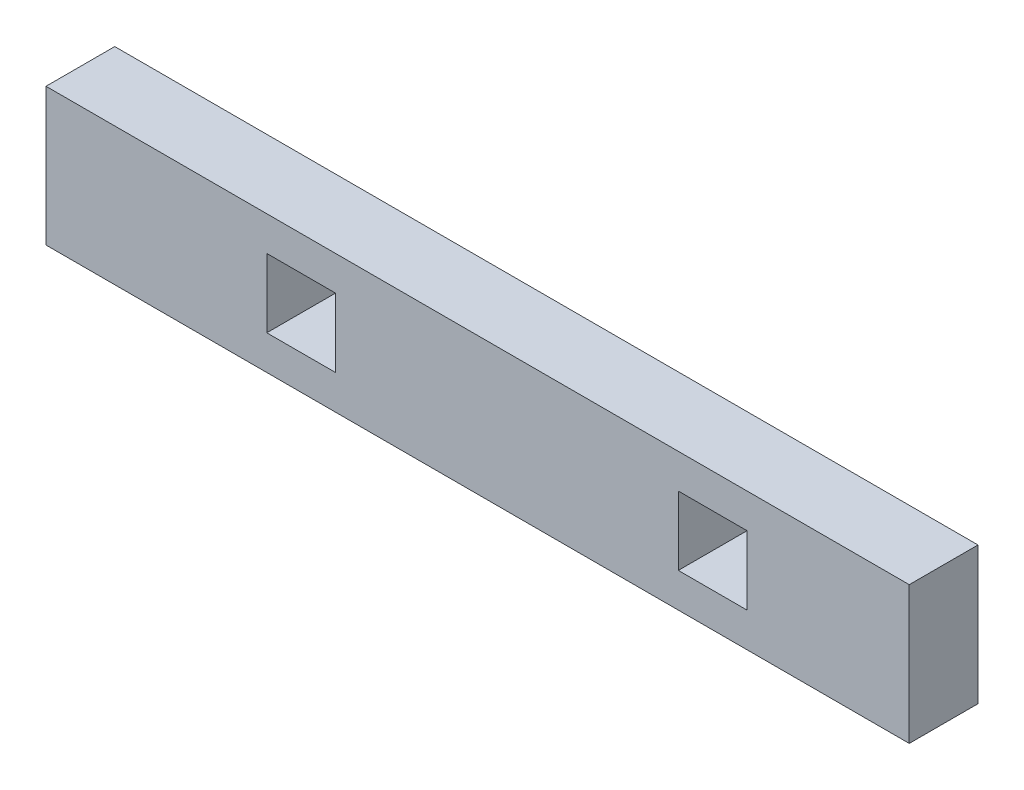
ISO-10303-21;
HEADER;
FILE_DESCRIPTION(('STEP AP214'),'2;1');
FILE_NAME('part.step','',(''),(''),'','','');
FILE_SCHEMA(('AUTOMOTIVE_DESIGN { 1 0 10303 214 1 1 1 1 }'));
ENDSEC;
DATA;
#1=APPLICATION_CONTEXT('core data for automotive mechanical design processes');
#2=APPLICATION_PROTOCOL_DEFINITION('international standard','automotive_design',2000,#1);
#3=PRODUCT_CONTEXT('',#1,'mechanical');
#4=PRODUCT('Part','Part','',(#3));
#5=PRODUCT_RELATED_PRODUCT_CATEGORY('part','',(#4));
#6=PRODUCT_DEFINITION_FORMATION('','',#4);
#7=PRODUCT_DEFINITION_CONTEXT('part definition',#1,'design');
#8=PRODUCT_DEFINITION('design','',#6,#7);
#9=PRODUCT_DEFINITION_SHAPE('','',#8);
#10=(LENGTH_UNIT() NAMED_UNIT(*) SI_UNIT(.MILLI.,.METRE.));
#11=(NAMED_UNIT(*) PLANE_ANGLE_UNIT() SI_UNIT($,.RADIAN.));
#12=(NAMED_UNIT(*) SI_UNIT($,.STERADIAN.) SOLID_ANGLE_UNIT());
#13=UNCERTAINTY_MEASURE_WITH_UNIT(LENGTH_MEASURE(1.E-05),#10,'distance_accuracy_value','');
#14=(GEOMETRIC_REPRESENTATION_CONTEXT(3) GLOBAL_UNCERTAINTY_ASSIGNED_CONTEXT((#13)) GLOBAL_UNIT_ASSIGNED_CONTEXT((#10,
#11,#12)) REPRESENTATION_CONTEXT('',''));
#15=CARTESIAN_POINT('',(0.,0.,0.));
#16=DIRECTION('',(0.,0.,1.));
#17=DIRECTION('',(1.,0.,0.));
#18=AXIS2_PLACEMENT_3D('',#15,#16,#17);
#19=CARTESIAN_POINT('',(23.5765793569799,-3.17948626636888,-43.5398164035787));
#20=DIRECTION('',(-1.,0.,0.));
#21=DIRECTION('',(0.,0.,1.));
#22=AXIS2_PLACEMENT_3D('',#19,#20,#21);
#23=PLANE('',#22);
#24=DIRECTION('',(0.,1.,0.));
#25=VECTOR('',#24,1.);
#26=CARTESIAN_POINT('',(23.5765793569799,-3.17948626636888,-3.17499999999999));
#27=LINE('',#26,#25);
#28=CARTESIAN_POINT('',(23.5765793569799,-3.17948626636888,-3.17499999999999));
#29=VERTEX_POINT('',#28);
#30=CARTESIAN_POINT('',(23.5765793569799,3.17051373363112,-3.17499999999999));
#31=VERTEX_POINT('',#30);
#32=EDGE_CURVE('E11',#29,#31,#27,.T.);
#33=ORIENTED_EDGE('',*,*,#32,.F.);
#34=DIRECTION('',(0.,0.,1.));
#35=VECTOR('',#34,1.);
#36=CARTESIAN_POINT('',(23.5765793569799,-3.17948626636888,-43.5398164035787));
#37=LINE('',#36,#35);
#38=CARTESIAN_POINT('',(23.5765793569799,-3.17948626636888,0.));
#39=VERTEX_POINT('',#38);
#40=EDGE_CURVE('E196',#29,#39,#37,.T.);
#41=ORIENTED_EDGE('',*,*,#40,.T.);
#42=DIRECTION('',(0.,-1.,0.));
#43=VECTOR('',#42,1.);
#44=CARTESIAN_POINT('',(23.5765793569799,-3.17948626636888,0.));
#45=LINE('',#44,#43);
#46=CARTESIAN_POINT('',(23.5765793569799,3.17051373363112,0.));
#47=VERTEX_POINT('',#46);
#48=EDGE_CURVE('E182',#47,#39,#45,.T.);
#49=ORIENTED_EDGE('',*,*,#48,.F.);
#50=DIRECTION('',(0.,0.,1.));
#51=VECTOR('',#50,1.);
#52=CARTESIAN_POINT('',(23.5765793569799,3.17051373363112,-43.5398164035787));
#53=LINE('',#52,#51);
#54=EDGE_CURVE('E191',#31,#47,#53,.T.);
#55=ORIENTED_EDGE('',*,*,#54,.F.);
#56=EDGE_LOOP('',(#33,#41,#49,#55));
#57=FACE_BOUND('',#56,.T.);
#58=ADVANCED_FACE('F34',(#57),#23,.T.);
#59=CARTESIAN_POINT('',(63.4387908271758,-3.17948626636888,-43.5398164035787));
#60=DIRECTION('',(0.,-1.,0.));
#61=DIRECTION('',(0.,0.,-1.));
#62=AXIS2_PLACEMENT_3D('',#59,#60,#61);
#63=PLANE('',#62);
#64=DIRECTION('',(-1.,0.,0.));
#65=VECTOR('',#64,1.);
#66=CARTESIAN_POINT('',(63.4387908271758,-3.17948626636888,-3.175));
#67=LINE('',#66,#65);
#68=CARTESIAN_POINT('',(63.4387908271758,-3.17948626636888,-3.175));
#69=VERTEX_POINT('',#68);
#70=EDGE_CURVE('E217',#69,#29,#67,.T.);
#71=ORIENTED_EDGE('',*,*,#70,.F.);
#72=DIRECTION('',(0.,0.,1.));
#73=VECTOR('',#72,1.);
#74=CARTESIAN_POINT('',(63.4387908271758,-3.17948626636888,-43.5398164035787));
#75=LINE('',#74,#73);
#76=CARTESIAN_POINT('',(63.4387908271758,-3.17948626636888,0.));
#77=VERTEX_POINT('',#76);
#78=EDGE_CURVE('E194',#69,#77,#75,.T.);
#79=ORIENTED_EDGE('',*,*,#78,.T.);
#80=DIRECTION('',(1.,0.,0.));
#81=VECTOR('',#80,1.);
#82=CARTESIAN_POINT('',(63.4387908271758,-3.17948626636888,0.));
#83=LINE('',#82,#81);
#84=EDGE_CURVE('E185',#39,#77,#83,.T.);
#85=ORIENTED_EDGE('',*,*,#84,.F.);
#86=ORIENTED_EDGE('',*,*,#40,.F.);
#87=EDGE_LOOP('',(#71,#79,#85,#86));
#88=FACE_BOUND('',#87,.T.);
#89=ADVANCED_FACE('F251',(#88),#63,.T.);
#90=CARTESIAN_POINT('',(63.4387908271758,3.17051373363112,-43.5398164035787));
#91=DIRECTION('',(1.,0.,0.));
#92=DIRECTION('',(0.,0.,-1.));
#93=AXIS2_PLACEMENT_3D('',#90,#91,#92);
#94=PLANE('',#93);
#95=DIRECTION('',(0.,-1.,0.));
#96=VECTOR('',#95,1.);
#97=CARTESIAN_POINT('',(63.4387908271758,3.17051373363112,-3.175));
#98=LINE('',#97,#96);
#99=CARTESIAN_POINT('',(63.4387908271758,3.17051373363112,-3.175));
#100=VERTEX_POINT('',#99);
#101=EDGE_CURVE('E214',#100,#69,#98,.T.);
#102=ORIENTED_EDGE('',*,*,#101,.F.);
#103=DIRECTION('',(0.,0.,1.));
#104=VECTOR('',#103,1.);
#105=CARTESIAN_POINT('',(63.4387908271758,3.17051373363112,-43.5398164035787));
#106=LINE('',#105,#104);
#107=CARTESIAN_POINT('',(63.4387908271758,3.17051373363112,0.));
#108=VERTEX_POINT('',#107);
#109=EDGE_CURVE('E192',#100,#108,#106,.T.);
#110=ORIENTED_EDGE('',*,*,#109,.T.);
#111=DIRECTION('',(0.,1.,0.));
#112=VECTOR('',#111,1.);
#113=CARTESIAN_POINT('',(63.4387908271758,3.17051373363112,0.));
#114=LINE('',#113,#112);
#115=EDGE_CURVE('E188',#77,#108,#114,.T.);
#116=ORIENTED_EDGE('',*,*,#115,.F.);
#117=ORIENTED_EDGE('',*,*,#78,.F.);
#118=EDGE_LOOP('',(#102,#110,#116,#117));
#119=FACE_BOUND('',#118,.T.);
#120=ADVANCED_FACE('F213',(#119),#94,.T.);
#121=CARTESIAN_POINT('',(23.5765793569799,3.17051373363112,-43.5398164035787));
#122=DIRECTION('',(0.,1.,0.));
#123=DIRECTION('',(0.,0.,1.));
#124=AXIS2_PLACEMENT_3D('',#121,#122,#123);
#125=PLANE('',#124);
#126=DIRECTION('',(1.,0.,0.));
#127=VECTOR('',#126,1.);
#128=CARTESIAN_POINT('',(23.5765793569799,3.17051373363112,-3.17499999999999));
#129=LINE('',#128,#127);
#130=EDGE_CURVE('E203',#31,#100,#129,.T.);
#131=ORIENTED_EDGE('',*,*,#130,.F.);
#132=ORIENTED_EDGE('',*,*,#54,.T.);
#133=DIRECTION('',(-1.,0.,0.));
#134=VECTOR('',#133,1.);
#135=CARTESIAN_POINT('',(23.5765793569799,3.17051373363112,0.));
#136=LINE('',#135,#134);
#137=EDGE_CURVE('E174',#108,#47,#136,.T.);
#138=ORIENTED_EDGE('',*,*,#137,.F.);
#139=ORIENTED_EDGE('',*,*,#109,.F.);
#140=EDGE_LOOP('',(#131,#132,#138,#139));
#141=FACE_BOUND('',#140,.T.);
#142=ADVANCED_FACE('F36',(#141),#125,.T.);
#143=CARTESIAN_POINT('',(55.9498483019922,-1.59198626636888,-43.5398164035787));
#144=DIRECTION('',(0.,-1.,0.));
#145=DIRECTION('',(0.,0.,-1.));
#146=AXIS2_PLACEMENT_3D('',#143,#144,#145);
#147=PLANE('',#146);
#148=DIRECTION('',(0.,0.,1.));
#149=VECTOR('',#148,1.);
#150=CARTESIAN_POINT('',(55.9498483019922,-1.59198626636888,-43.5398164035787));
#151=LINE('',#150,#149);
#152=CARTESIAN_POINT('',(55.9498483019922,-1.59198626636888,-3.175));
#153=VERTEX_POINT('',#152);
#154=CARTESIAN_POINT('',(55.9498483019922,-1.59198626636888,0.));
#155=VERTEX_POINT('',#154);
#156=EDGE_CURVE('E177',#153,#155,#151,.T.);
#157=ORIENTED_EDGE('',*,*,#156,.F.);
#158=DIRECTION('',(-1.,0.,0.));
#159=VECTOR('',#158,1.);
#160=CARTESIAN_POINT('',(55.9498483019922,-1.59198626636888,-3.175));
#161=LINE('',#160,#159);
#162=CARTESIAN_POINT('',(52.7748483019922,-1.59198626636888,-3.175));
#163=VERTEX_POINT('',#162);
#164=EDGE_CURVE('E53',#153,#163,#161,.T.);
#165=ORIENTED_EDGE('',*,*,#164,.T.);
#166=DIRECTION('',(0.,0.,1.));
#167=VECTOR('',#166,1.);
#168=CARTESIAN_POINT('',(52.7748483019922,-1.59198626636888,-43.5398164035787));
#169=LINE('',#168,#167);
#170=CARTESIAN_POINT('',(52.7748483019922,-1.59198626636888,0.));
#171=VERTEX_POINT('',#170);
#172=EDGE_CURVE('E171',#163,#171,#169,.T.);
#173=ORIENTED_EDGE('',*,*,#172,.T.);
#174=DIRECTION('',(1.,0.,0.));
#175=VECTOR('',#174,1.);
#176=CARTESIAN_POINT('',(55.9498483019922,-1.59198626636888,0.));
#177=LINE('',#176,#175);
#178=EDGE_CURVE('E162',#171,#155,#177,.T.);
#179=ORIENTED_EDGE('',*,*,#178,.T.);
#180=EDGE_LOOP('',(#157,#165,#173,#179));
#181=FACE_BOUND('',#180,.T.);
#182=ADVANCED_FACE('F265',(#181),#147,.F.);
#183=CARTESIAN_POINT('',(55.9498483019922,1.58301373363112,-43.5398164035787));
#184=DIRECTION('',(1.,0.,0.));
#185=DIRECTION('',(0.,0.,-1.));
#186=AXIS2_PLACEMENT_3D('',#183,#184,#185);
#187=PLANE('',#186);
#188=DIRECTION('',(0.,0.,1.));
#189=VECTOR('',#188,1.);
#190=CARTESIAN_POINT('',(55.9498483019922,1.58301373363112,-43.5398164035787));
#191=LINE('',#190,#189);
#192=CARTESIAN_POINT('',(55.9498483019922,1.58301373363112,-3.175));
#193=VERTEX_POINT('',#192);
#194=CARTESIAN_POINT('',(55.9498483019922,1.58301373363112,0.));
#195=VERTEX_POINT('',#194);
#196=EDGE_CURVE('E175',#193,#195,#191,.T.);
#197=ORIENTED_EDGE('',*,*,#196,.F.);
#198=DIRECTION('',(0.,-1.,0.));
#199=VECTOR('',#198,1.);
#200=CARTESIAN_POINT('',(55.9498483019922,1.58301373363112,-3.175));
#201=LINE('',#200,#199);
#202=EDGE_CURVE('E44',#193,#153,#201,.T.);
#203=ORIENTED_EDGE('',*,*,#202,.T.);
#204=ORIENTED_EDGE('',*,*,#156,.T.);
#205=DIRECTION('',(0.,1.,0.));
#206=VECTOR('',#205,1.);
#207=CARTESIAN_POINT('',(55.9498483019922,1.58301373363112,0.));
#208=LINE('',#207,#206);
#209=EDGE_CURVE('E165',#155,#195,#208,.T.);
#210=ORIENTED_EDGE('',*,*,#209,.T.);
#211=EDGE_LOOP('',(#197,#203,#204,#210));
#212=FACE_BOUND('',#211,.T.);
#213=ADVANCED_FACE('F268',(#212),#187,.F.);
#214=CARTESIAN_POINT('',(52.7748483019922,1.58301373363112,-43.5398164035787));
#215=DIRECTION('',(0.,1.,0.));
#216=DIRECTION('',(0.,0.,1.));
#217=AXIS2_PLACEMENT_3D('',#214,#215,#216);
#218=PLANE('',#217);
#219=DIRECTION('',(0.,0.,1.));
#220=VECTOR('',#219,1.);
#221=CARTESIAN_POINT('',(52.7748483019922,1.58301373363112,-43.5398164035787));
#222=LINE('',#221,#220);
#223=CARTESIAN_POINT('',(52.7748483019922,1.58301373363112,-3.175));
#224=VERTEX_POINT('',#223);
#225=CARTESIAN_POINT('',(52.7748483019922,1.58301373363112,0.));
#226=VERTEX_POINT('',#225);
#227=EDGE_CURVE('E172',#224,#226,#222,.T.);
#228=ORIENTED_EDGE('',*,*,#227,.F.);
#229=DIRECTION('',(1.,0.,0.));
#230=VECTOR('',#229,1.);
#231=CARTESIAN_POINT('',(52.7748483019923,1.58301373363112,-3.175));
#232=LINE('',#231,#230);
#233=EDGE_CURVE('E73',#224,#193,#232,.T.);
#234=ORIENTED_EDGE('',*,*,#233,.T.);
#235=ORIENTED_EDGE('',*,*,#196,.T.);
#236=DIRECTION('',(-1.,0.,0.));
#237=VECTOR('',#236,1.);
#238=CARTESIAN_POINT('',(52.7748483019922,1.58301373363112,0.));
#239=LINE('',#238,#237);
#240=EDGE_CURVE('E168',#195,#226,#239,.T.);
#241=ORIENTED_EDGE('',*,*,#240,.T.);
#242=EDGE_LOOP('',(#228,#234,#235,#241));
#243=FACE_BOUND('',#242,.T.);
#244=ADVANCED_FACE('F264',(#243),#218,.F.);
#245=CARTESIAN_POINT('',(52.7748483019922,-1.59198626636888,-43.5398164035787));
#246=DIRECTION('',(-1.,0.,0.));
#247=DIRECTION('',(0.,0.,1.));
#248=AXIS2_PLACEMENT_3D('',#245,#246,#247);
#249=PLANE('',#248);
#250=ORIENTED_EDGE('',*,*,#172,.F.);
#251=DIRECTION('',(0.,1.,0.));
#252=VECTOR('',#251,1.);
#253=CARTESIAN_POINT('',(52.7748483019922,-1.59198626636888,-3.175));
#254=LINE('',#253,#252);
#255=EDGE_CURVE('E231',#163,#224,#254,.T.);
#256=ORIENTED_EDGE('',*,*,#255,.T.);
#257=ORIENTED_EDGE('',*,*,#227,.T.);
#258=DIRECTION('',(0.,-1.,0.));
#259=VECTOR('',#258,1.);
#260=CARTESIAN_POINT('',(52.7748483019922,-1.59198626636888,0.));
#261=LINE('',#260,#259);
#262=EDGE_CURVE('E157',#226,#171,#261,.T.);
#263=ORIENTED_EDGE('',*,*,#262,.T.);
#264=EDGE_LOOP('',(#250,#256,#257,#263));
#265=FACE_BOUND('',#264,.T.);
#266=ADVANCED_FACE('F241',(#265),#249,.F.);
#267=CARTESIAN_POINT('',(0.,0.,0.));
#268=DIRECTION('',(0.,0.,-1.));
#269=DIRECTION('',(-1.,0.,0.));
#270=AXIS2_PLACEMENT_3D('',#267,#268,#269);
#271=PLANE('',#270);
#272=DIRECTION('',(-1.,0.,0.));
#273=VECTOR('',#272,1.);
#274=CARTESIAN_POINT('',(36.9459311868585,1.58301373363111,0.));
#275=LINE('',#274,#273);
#276=CARTESIAN_POINT('',(36.9459311868585,1.58301373363111,0.));
#277=VERTEX_POINT('',#276);
#278=CARTESIAN_POINT('',(33.7709311868585,1.58301373363111,0.));
#279=VERTEX_POINT('',#278);
#280=EDGE_CURVE('E139',#277,#279,#275,.T.);
#281=ORIENTED_EDGE('',*,*,#280,.F.);
#282=DIRECTION('',(0.,1.,0.));
#283=VECTOR('',#282,1.);
#284=CARTESIAN_POINT('',(36.9459311868585,-1.59198626636888,0.));
#285=LINE('',#284,#283);
#286=CARTESIAN_POINT('',(36.9459311868585,-1.59198626636888,0.));
#287=VERTEX_POINT('',#286);
#288=EDGE_CURVE('E145',#287,#277,#285,.T.);
#289=ORIENTED_EDGE('',*,*,#288,.F.);
#290=DIRECTION('',(1.,0.,0.));
#291=VECTOR('',#290,1.);
#292=CARTESIAN_POINT('',(33.7709311868585,-1.59198626636888,0.));
#293=LINE('',#292,#291);
#294=CARTESIAN_POINT('',(33.7709311868585,-1.59198626636888,0.));
#295=VERTEX_POINT('',#294);
#296=EDGE_CURVE('E150',#295,#287,#293,.T.);
#297=ORIENTED_EDGE('',*,*,#296,.F.);
#298=DIRECTION('',(0.,-1.,0.));
#299=VECTOR('',#298,1.);
#300=CARTESIAN_POINT('',(33.7709311868585,1.58301373363111,0.));
#301=LINE('',#300,#299);
#302=EDGE_CURVE('E132',#279,#295,#301,.T.);
#303=ORIENTED_EDGE('',*,*,#302,.F.);
#304=EDGE_LOOP('',(#281,#289,#297,#303));
#305=FACE_BOUND('',#304,.T.);
#306=ORIENTED_EDGE('',*,*,#178,.F.);
#307=ORIENTED_EDGE('',*,*,#262,.F.);
#308=ORIENTED_EDGE('',*,*,#240,.F.);
#309=ORIENTED_EDGE('',*,*,#209,.F.);
#310=EDGE_LOOP('',(#306,#307,#308,#309));
#311=FACE_BOUND('',#310,.T.);
#312=ORIENTED_EDGE('',*,*,#137,.T.);
#313=ORIENTED_EDGE('',*,*,#48,.T.);
#314=ORIENTED_EDGE('',*,*,#84,.T.);
#315=ORIENTED_EDGE('',*,*,#115,.T.);
#316=EDGE_LOOP('',(#312,#313,#314,#315));
#317=FACE_BOUND('',#316,.T.);
#318=ADVANCED_FACE('F147',(#305,#311,#317),#271,.F.);
#319=CARTESIAN_POINT('',(36.9459311868585,1.58301373363111,-43.5398164035787));
#320=DIRECTION('',(0.,1.,0.));
#321=DIRECTION('',(0.,0.,1.));
#322=AXIS2_PLACEMENT_3D('',#319,#320,#321);
#323=PLANE('',#322);
#324=DIRECTION('',(0.,0.,1.));
#325=VECTOR('',#324,1.);
#326=CARTESIAN_POINT('',(33.7709311868585,1.58301373363111,-43.5398164035787));
#327=LINE('',#326,#325);
#328=CARTESIAN_POINT('',(33.7709311868585,1.58301373363111,-3.17499999999999));
#329=VERTEX_POINT('',#328);
#330=EDGE_CURVE('E128',#329,#279,#327,.T.);
#331=ORIENTED_EDGE('',*,*,#330,.F.);
#332=DIRECTION('',(1.,0.,0.));
#333=VECTOR('',#332,1.);
#334=CARTESIAN_POINT('',(36.9459311868585,1.58301373363111,-3.17499999999999));
#335=LINE('',#334,#333);
#336=CARTESIAN_POINT('',(36.9459311868585,1.58301373363111,-3.17499999999999));
#337=VERTEX_POINT('',#336);
#338=EDGE_CURVE('E38',#329,#337,#335,.T.);
#339=ORIENTED_EDGE('',*,*,#338,.T.);
#340=DIRECTION('',(0.,0.,1.));
#341=VECTOR('',#340,1.);
#342=CARTESIAN_POINT('',(36.9459311868585,1.58301373363111,-43.5398164035787));
#343=LINE('',#342,#341);
#344=EDGE_CURVE('E136',#337,#277,#343,.T.);
#345=ORIENTED_EDGE('',*,*,#344,.T.);
#346=ORIENTED_EDGE('',*,*,#280,.T.);
#347=EDGE_LOOP('',(#331,#339,#345,#346));
#348=FACE_BOUND('',#347,.T.);
#349=ADVANCED_FACE('F140',(#348),#323,.F.);
#350=CARTESIAN_POINT('',(33.7709311868585,1.58301373363111,-43.5398164035787));
#351=DIRECTION('',(-1.,0.,0.));
#352=DIRECTION('',(0.,0.,1.));
#353=AXIS2_PLACEMENT_3D('',#350,#351,#352);
#354=PLANE('',#353);
#355=DIRECTION('',(0.,0.,1.));
#356=VECTOR('',#355,1.);
#357=CARTESIAN_POINT('',(33.7709311868585,-1.59198626636888,-43.5398164035787));
#358=LINE('',#357,#356);
#359=CARTESIAN_POINT('',(33.7709311868585,-1.59198626636888,-3.17499999999999));
#360=VERTEX_POINT('',#359);
#361=EDGE_CURVE('E135',#360,#295,#358,.T.);
#362=ORIENTED_EDGE('',*,*,#361,.F.);
#363=DIRECTION('',(0.,1.,0.));
#364=VECTOR('',#363,1.);
#365=CARTESIAN_POINT('',(33.7709311868585,1.58301373363111,-3.17499999999999));
#366=LINE('',#365,#364);
#367=EDGE_CURVE('E67',#360,#329,#366,.T.);
#368=ORIENTED_EDGE('',*,*,#367,.T.);
#369=ORIENTED_EDGE('',*,*,#330,.T.);
#370=ORIENTED_EDGE('',*,*,#302,.T.);
#371=EDGE_LOOP('',(#362,#368,#369,#370));
#372=FACE_BOUND('',#371,.T.);
#373=ADVANCED_FACE('F130',(#372),#354,.F.);
#374=CARTESIAN_POINT('',(33.7709311868585,-1.59198626636888,-43.5398164035787));
#375=DIRECTION('',(0.,-1.,0.));
#376=DIRECTION('',(1.,0.,0.));
#377=AXIS2_PLACEMENT_3D('',#374,#375,#376);
#378=PLANE('',#377);
#379=DIRECTION('',(0.,0.,1.));
#380=VECTOR('',#379,1.);
#381=CARTESIAN_POINT('',(36.9459311868585,-1.59198626636888,-43.5398164035787));
#382=LINE('',#381,#380);
#383=CARTESIAN_POINT('',(36.9459311868585,-1.59198626636888,-3.17499999999999));
#384=VERTEX_POINT('',#383);
#385=EDGE_CURVE('E155',#384,#287,#382,.T.);
#386=ORIENTED_EDGE('',*,*,#385,.F.);
#387=DIRECTION('',(-1.,0.,0.));
#388=VECTOR('',#387,1.);
#389=CARTESIAN_POINT('',(33.7709311868585,-1.59198626636888,-3.17499999999999));
#390=LINE('',#389,#388);
#391=EDGE_CURVE('E229',#384,#360,#390,.T.);
#392=ORIENTED_EDGE('',*,*,#391,.T.);
#393=ORIENTED_EDGE('',*,*,#361,.T.);
#394=ORIENTED_EDGE('',*,*,#296,.T.);
#395=EDGE_LOOP('',(#386,#392,#393,#394));
#396=FACE_BOUND('',#395,.T.);
#397=ADVANCED_FACE('F228',(#396),#378,.F.);
#398=CARTESIAN_POINT('',(36.9459311868585,-1.59198626636888,-43.5398164035787));
#399=DIRECTION('',(1.,0.,0.));
#400=DIRECTION('',(0.,0.,-1.));
#401=AXIS2_PLACEMENT_3D('',#398,#399,#400);
#402=PLANE('',#401);
#403=ORIENTED_EDGE('',*,*,#344,.F.);
#404=DIRECTION('',(0.,-1.,0.));
#405=VECTOR('',#404,1.);
#406=CARTESIAN_POINT('',(36.9459311868585,-1.59198626636888,-3.17499999999999));
#407=LINE('',#406,#405);
#408=EDGE_CURVE('E219',#337,#384,#407,.T.);
#409=ORIENTED_EDGE('',*,*,#408,.T.);
#410=ORIENTED_EDGE('',*,*,#385,.T.);
#411=ORIENTED_EDGE('',*,*,#288,.T.);
#412=EDGE_LOOP('',(#403,#409,#410,#411));
#413=FACE_BOUND('',#412,.T.);
#414=ADVANCED_FACE('F223',(#413),#402,.F.);
#415=CARTESIAN_POINT('',(55.9498483019922,22.1352711337319,-3.175));
#416=DIRECTION('',(0.,0.,1.));
#417=DIRECTION('',(1.,0.,0.));
#418=AXIS2_PLACEMENT_3D('',#415,#416,#417);
#419=PLANE('',#418);
#420=ORIENTED_EDGE('',*,*,#130,.T.);
#421=ORIENTED_EDGE('',*,*,#101,.T.);
#422=ORIENTED_EDGE('',*,*,#70,.T.);
#423=ORIENTED_EDGE('',*,*,#32,.T.);
#424=EDGE_LOOP('',(#420,#421,#422,#423));
#425=FACE_BOUND('',#424,.T.);
#426=ORIENTED_EDGE('',*,*,#338,.F.);
#427=ORIENTED_EDGE('',*,*,#367,.F.);
#428=ORIENTED_EDGE('',*,*,#391,.F.);
#429=ORIENTED_EDGE('',*,*,#408,.F.);
#430=EDGE_LOOP('',(#426,#427,#428,#429));
#431=FACE_BOUND('',#430,.T.);
#432=ORIENTED_EDGE('',*,*,#164,.F.);
#433=ORIENTED_EDGE('',*,*,#202,.F.);
#434=ORIENTED_EDGE('',*,*,#233,.F.);
#435=ORIENTED_EDGE('',*,*,#255,.F.);
#436=EDGE_LOOP('',(#432,#433,#434,#435));
#437=FACE_BOUND('',#436,.T.);
#438=ADVANCED_FACE('F242',(#425,#431,#437),#419,.F.);
#439=CLOSED_SHELL('',(#58,#89,#120,#142,#182,#213,#244,#266,#318,#349,#373,#397,#414,#438));
#440=MANIFOLD_SOLID_BREP('B2',#439);
#441=ADVANCED_BREP_SHAPE_REPRESENTATION('',(#18,#440),#14);
#442=SHAPE_DEFINITION_REPRESENTATION(#9,#441);
ENDSEC;
END-ISO-10303-21;
